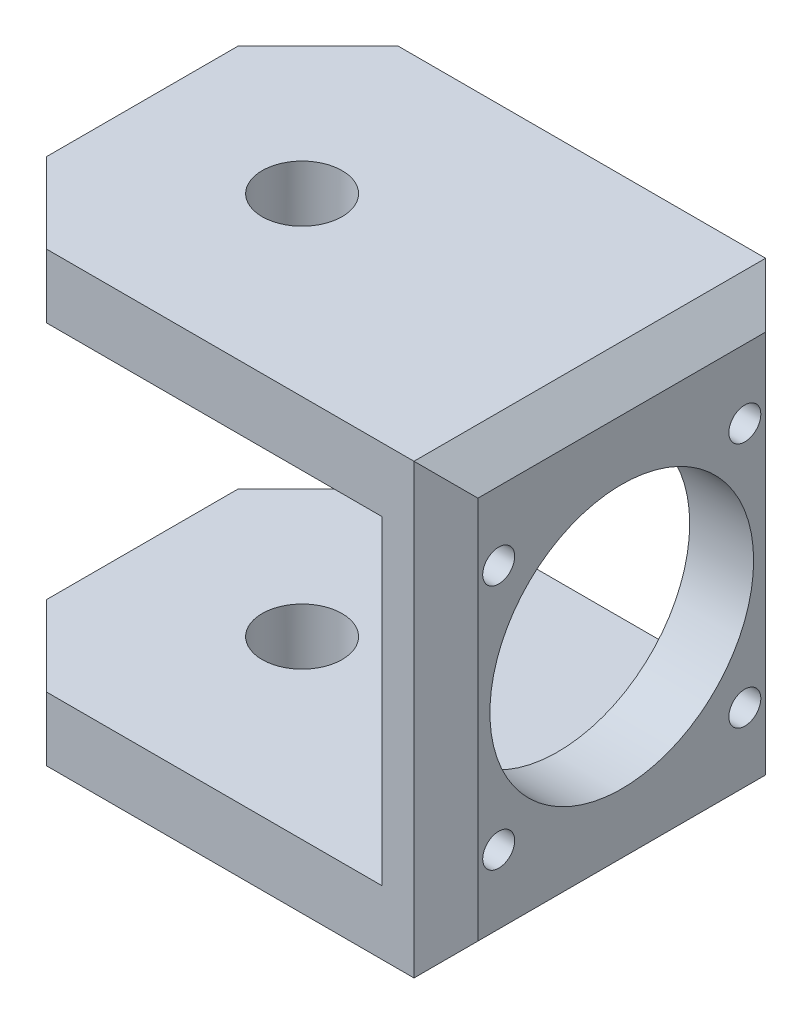
ISO-10303-21;
HEADER;
FILE_DESCRIPTION(('STEP AP214'),'2;1');
FILE_NAME('part.step','',(''),(''),'','','');
FILE_SCHEMA(('AUTOMOTIVE_DESIGN { 1 0 10303 214 1 1 1 1 }'));
ENDSEC;
DATA;
#1=APPLICATION_CONTEXT('core data for automotive mechanical design processes');
#2=APPLICATION_PROTOCOL_DEFINITION('international standard','automotive_design',2000,#1);
#3=PRODUCT_CONTEXT('',#1,'mechanical');
#4=PRODUCT('Part','Part','',(#3));
#5=PRODUCT_RELATED_PRODUCT_CATEGORY('part','',(#4));
#6=PRODUCT_DEFINITION_FORMATION('','',#4);
#7=PRODUCT_DEFINITION_CONTEXT('part definition',#1,'design');
#8=PRODUCT_DEFINITION('design','',#6,#7);
#9=PRODUCT_DEFINITION_SHAPE('','',#8);
#10=(LENGTH_UNIT() NAMED_UNIT(*) SI_UNIT(.MILLI.,.METRE.));
#11=(NAMED_UNIT(*) PLANE_ANGLE_UNIT() SI_UNIT($,.RADIAN.));
#12=(NAMED_UNIT(*) SI_UNIT($,.STERADIAN.) SOLID_ANGLE_UNIT());
#13=UNCERTAINTY_MEASURE_WITH_UNIT(LENGTH_MEASURE(1.E-05),#10,'distance_accuracy_value','');
#14=(GEOMETRIC_REPRESENTATION_CONTEXT(3) GLOBAL_UNCERTAINTY_ASSIGNED_CONTEXT((#13)) GLOBAL_UNIT_ASSIGNED_CONTEXT((#10,
#11,#12)) REPRESENTATION_CONTEXT('',''));
#15=CARTESIAN_POINT('',(0.,0.,0.));
#16=DIRECTION('',(0.,0.,1.));
#17=DIRECTION('',(1.,0.,0.));
#18=AXIS2_PLACEMENT_3D('',#15,#16,#17);
#19=CARTESIAN_POINT('',(0.,4.,0.));
#20=DIRECTION('',(0.,-1.,0.));
#21=DIRECTION('',(0.,0.,-1.));
#22=AXIS2_PLACEMENT_3D('',#19,#20,#21);
#23=PLANE('',#22);
#24=CARTESIAN_POINT('',(-5.,4.,0.));
#25=DIRECTION('',(0.,-1.,0.));
#26=DIRECTION('',(0.,0.,-1.));
#27=AXIS2_PLACEMENT_3D('',#24,#25,#26);
#28=CIRCLE('',#27,2.5);
#29=CARTESIAN_POINT('',(-5.,4.,-2.5));
#30=VERTEX_POINT('',#29);
#31=EDGE_CURVE('E262',#30,#30,#28,.T.);
#32=ORIENTED_EDGE('',*,*,#31,.T.);
#33=EDGE_LOOP('',(#32));
#34=FACE_BOUND('',#33,.T.);
#35=DIRECTION('',(0.,0.,1.));
#36=VECTOR('',#35,1.);
#37=CARTESIAN_POINT('',(-15.,4.,11.));
#38=LINE('',#37,#36);
#39=CARTESIAN_POINT('',(-15.,4.,-6.));
#40=VERTEX_POINT('',#39);
#41=CARTESIAN_POINT('',(-15.,4.,5.99999999999999));
#42=VERTEX_POINT('',#41);
#43=EDGE_CURVE('E181',#40,#42,#38,.T.);
#44=ORIENTED_EDGE('',*,*,#43,.T.);
#45=DIRECTION('',(-0.707106781186546,0.,-0.707106781186549));
#46=VECTOR('',#45,1.);
#47=CARTESIAN_POINT('',(-10.,4.,11.));
#48=LINE('',#47,#46);
#49=CARTESIAN_POINT('',(-10.,4.,11.));
#50=VERTEX_POINT('',#49);
#51=EDGE_CURVE('E208',#42,#50,#48,.F.);
#52=ORIENTED_EDGE('',*,*,#51,.T.);
#53=DIRECTION('',(1.,0.,0.));
#54=VECTOR('',#53,1.);
#55=CARTESIAN_POINT('',(-15.,4.,11.));
#56=LINE('',#55,#54);
#57=CARTESIAN_POINT('',(11.,4.,11.));
#58=VERTEX_POINT('',#57);
#59=EDGE_CURVE('E185',#50,#58,#56,.T.);
#60=ORIENTED_EDGE('',*,*,#59,.T.);
#61=DIRECTION('',(0.,0.,1.));
#62=VECTOR('',#61,1.);
#63=CARTESIAN_POINT('',(11.,4.,-11.));
#64=LINE('',#63,#62);
#65=CARTESIAN_POINT('',(11.,4.,-11.));
#66=VERTEX_POINT('',#65);
#67=EDGE_CURVE('E164',#66,#58,#64,.T.);
#68=ORIENTED_EDGE('',*,*,#67,.F.);
#69=DIRECTION('',(-1.,0.,0.));
#70=VECTOR('',#69,1.);
#71=CARTESIAN_POINT('',(-15.,4.,-11.));
#72=LINE('',#71,#70);
#73=CARTESIAN_POINT('',(-9.99999999999998,4.,-11.));
#74=VERTEX_POINT('',#73);
#75=EDGE_CURVE('E178',#66,#74,#72,.T.);
#76=ORIENTED_EDGE('',*,*,#75,.T.);
#77=DIRECTION('',(0.707106781186549,0.,-0.707106781186546));
#78=VECTOR('',#77,1.);
#79=CARTESIAN_POINT('',(-15.,4.,-6.));
#80=LINE('',#79,#78);
#81=EDGE_CURVE('E206',#74,#40,#80,.F.);
#82=ORIENTED_EDGE('',*,*,#81,.T.);
#83=EDGE_LOOP('',(#44,#52,#60,#68,#76,#82));
#84=FACE_BOUND('',#83,.T.);
#85=ADVANCED_FACE('F40',(#34,#84),#23,.F.);
#86=CARTESIAN_POINT('',(15.,4.,11.));
#87=DIRECTION('',(-1.,0.,0.));
#88=DIRECTION('',(0.,0.,1.));
#89=AXIS2_PLACEMENT_3D('',#86,#87,#88);
#90=PLANE('',#89);
#91=DIRECTION('',(0.,0.,-1.));
#92=VECTOR('',#91,1.);
#93=CARTESIAN_POINT('',(15.,2.00000000000001,-11.));
#94=LINE('',#93,#92);
#95=CARTESIAN_POINT('',(15.,2.00000000000001,8.99999999999999));
#96=VERTEX_POINT('',#95);
#97=CARTESIAN_POINT('',(15.,2.00000000000001,-8.99999999999999));
#98=VERTEX_POINT('',#97);
#99=EDGE_CURVE('E252',#96,#98,#94,.T.);
#100=ORIENTED_EDGE('',*,*,#99,.T.);
#101=DIRECTION('',(0.,1.,0.));
#102=VECTOR('',#101,1.);
#103=CARTESIAN_POINT('',(15.,4.,-8.99999999999999));
#104=LINE('',#103,#102);
#105=CARTESIAN_POINT('',(15.,26.,-8.99999999999999));
#106=VERTEX_POINT('',#105);
#107=EDGE_CURVE('E254',#98,#106,#104,.T.);
#108=ORIENTED_EDGE('',*,*,#107,.T.);
#109=DIRECTION('',(0.,0.,1.));
#110=VECTOR('',#109,1.);
#111=CARTESIAN_POINT('',(15.,26.,11.));
#112=LINE('',#111,#110);
#113=CARTESIAN_POINT('',(15.,26.,8.99999999999999));
#114=VERTEX_POINT('',#113);
#115=EDGE_CURVE('E248',#106,#114,#112,.T.);
#116=ORIENTED_EDGE('',*,*,#115,.T.);
#117=DIRECTION('',(0.,-1.,0.));
#118=VECTOR('',#117,1.);
#119=CARTESIAN_POINT('',(15.,4.,8.99999999999999));
#120=LINE('',#119,#118);
#121=EDGE_CURVE('E250',#114,#96,#120,.T.);
#122=ORIENTED_EDGE('',*,*,#121,.T.);
#123=EDGE_LOOP('',(#100,#108,#116,#122));
#124=FACE_BOUND('',#123,.T.);
#125=CARTESIAN_POINT('',(15.,6.3,-7.69999999999992));
#126=DIRECTION('',(1.,0.,0.));
#127=DIRECTION('',(0.,0.,-1.));
#128=AXIS2_PLACEMENT_3D('',#125,#126,#127);
#129=CIRCLE('',#128,1.);
#130=CARTESIAN_POINT('',(15.,6.3,-8.69999999999992));
#131=VERTEX_POINT('',#130);
#132=EDGE_CURVE('E268',#131,#131,#129,.T.);
#133=ORIENTED_EDGE('',*,*,#132,.F.);
#134=EDGE_LOOP('',(#133));
#135=FACE_BOUND('',#134,.T.);
#136=CARTESIAN_POINT('',(15.,21.7,-7.69999999999997));
#137=DIRECTION('',(1.,0.,0.));
#138=DIRECTION('',(0.,0.,-1.));
#139=AXIS2_PLACEMENT_3D('',#136,#137,#138);
#140=CIRCLE('',#139,1.);
#141=CARTESIAN_POINT('',(15.,21.7,-8.69999999999997));
#142=VERTEX_POINT('',#141);
#143=EDGE_CURVE('E274',#142,#142,#140,.T.);
#144=ORIENTED_EDGE('',*,*,#143,.F.);
#145=EDGE_LOOP('',(#144));
#146=FACE_BOUND('',#145,.T.);
#147=CARTESIAN_POINT('',(15.,21.6999999999999,7.69999999999997));
#148=DIRECTION('',(1.,0.,0.));
#149=DIRECTION('',(0.,0.,-1.));
#150=AXIS2_PLACEMENT_3D('',#147,#148,#149);
#151=CIRCLE('',#150,1.);
#152=CARTESIAN_POINT('',(15.,21.6999999999999,6.69999999999997));
#153=VERTEX_POINT('',#152);
#154=EDGE_CURVE('E279',#153,#153,#151,.T.);
#155=ORIENTED_EDGE('',*,*,#154,.F.);
#156=EDGE_LOOP('',(#155));
#157=FACE_BOUND('',#156,.T.);
#158=CARTESIAN_POINT('',(15.,6.3,7.69999999999992));
#159=DIRECTION('',(1.,0.,0.));
#160=DIRECTION('',(0.,0.,-1.));
#161=AXIS2_PLACEMENT_3D('',#158,#159,#160);
#162=CIRCLE('',#161,1.);
#163=CARTESIAN_POINT('',(15.,6.3,6.69999999999992));
#164=VERTEX_POINT('',#163);
#165=EDGE_CURVE('E237',#164,#164,#162,.T.);
#166=ORIENTED_EDGE('',*,*,#165,.F.);
#167=EDGE_LOOP('',(#166));
#168=FACE_BOUND('',#167,.T.);
#169=CARTESIAN_POINT('',(15.,14.,0.));
#170=DIRECTION('',(1.,0.,0.));
#171=DIRECTION('',(0.,0.,-1.));
#172=AXIS2_PLACEMENT_3D('',#169,#170,#171);
#173=CIRCLE('',#172,8.25);
#174=CARTESIAN_POINT('',(15.,14.,-8.25));
#175=VERTEX_POINT('',#174);
#176=EDGE_CURVE('E232',#175,#175,#173,.T.);
#177=ORIENTED_EDGE('',*,*,#176,.F.);
#178=EDGE_LOOP('',(#177));
#179=FACE_BOUND('',#178,.T.);
#180=ADVANCED_FACE('F336',(#124,#135,#146,#157,#168,#179),#90,.F.);
#181=CARTESIAN_POINT('',(-15.,4.,-11.));
#182=DIRECTION('',(0.,0.,1.));
#183=DIRECTION('',(1.,0.,0.));
#184=AXIS2_PLACEMENT_3D('',#181,#182,#183);
#185=PLANE('',#184);
#186=DIRECTION('',(-1.,0.,0.));
#187=VECTOR('',#186,1.);
#188=CARTESIAN_POINT('',(15.,28.,-11.));
#189=LINE('',#188,#187);
#190=CARTESIAN_POINT('',(13.,28.,-11.));
#191=VERTEX_POINT('',#190);
#192=CARTESIAN_POINT('',(-9.99999999999998,28.,-11.));
#193=VERTEX_POINT('',#192);
#194=EDGE_CURVE('E154',#191,#193,#189,.T.);
#195=ORIENTED_EDGE('',*,*,#194,.F.);
#196=DIRECTION('',(0.,-1.,0.));
#197=VECTOR('',#196,1.);
#198=CARTESIAN_POINT('',(13.,4.,-11.));
#199=LINE('',#198,#197);
#200=CARTESIAN_POINT('',(13.,0.,-11.));
#201=VERTEX_POINT('',#200);
#202=EDGE_CURVE('E228',#191,#201,#199,.T.);
#203=ORIENTED_EDGE('',*,*,#202,.T.);
#204=DIRECTION('',(-1.,0.,0.));
#205=VECTOR('',#204,1.);
#206=CARTESIAN_POINT('',(-15.,0.,-11.));
#207=LINE('',#206,#205);
#208=CARTESIAN_POINT('',(-9.99999999999998,0.,-11.));
#209=VERTEX_POINT('',#208);
#210=EDGE_CURVE('E177',#201,#209,#207,.T.);
#211=ORIENTED_EDGE('',*,*,#210,.T.);
#212=DIRECTION('',(0.,1.,0.));
#213=VECTOR('',#212,1.);
#214=CARTESIAN_POINT('',(-9.99999999999998,4.,-11.));
#215=LINE('',#214,#213);
#216=EDGE_CURVE('E213',#209,#74,#215,.T.);
#217=ORIENTED_EDGE('',*,*,#216,.T.);
#218=ORIENTED_EDGE('',*,*,#75,.F.);
#219=DIRECTION('',(0.,-1.,0.));
#220=VECTOR('',#219,1.);
#221=CARTESIAN_POINT('',(11.,24.,-11.));
#222=LINE('',#221,#220);
#223=CARTESIAN_POINT('',(11.,24.,-11.));
#224=VERTEX_POINT('',#223);
#225=EDGE_CURVE('E165',#224,#66,#222,.T.);
#226=ORIENTED_EDGE('',*,*,#225,.F.);
#227=DIRECTION('',(-1.,0.,0.));
#228=VECTOR('',#227,1.);
#229=CARTESIAN_POINT('',(15.,24.,-11.));
#230=LINE('',#229,#228);
#231=CARTESIAN_POINT('',(-9.99999999999998,24.,-11.));
#232=VERTEX_POINT('',#231);
#233=EDGE_CURVE('E170',#224,#232,#230,.T.);
#234=ORIENTED_EDGE('',*,*,#233,.T.);
#235=DIRECTION('',(0.,1.,0.));
#236=VECTOR('',#235,1.);
#237=CARTESIAN_POINT('',(-9.99999999999998,4.,-11.));
#238=LINE('',#237,#236);
#239=EDGE_CURVE('E210',#232,#193,#238,.T.);
#240=ORIENTED_EDGE('',*,*,#239,.T.);
#241=EDGE_LOOP('',(#195,#203,#211,#217,#218,#226,#234,#240));
#242=FACE_BOUND('',#241,.T.);
#243=ADVANCED_FACE('F309',(#242),#185,.F.);
#244=CARTESIAN_POINT('',(-15.,4.,11.));
#245=DIRECTION('',(1.,0.,0.));
#246=DIRECTION('',(0.,0.,-1.));
#247=AXIS2_PLACEMENT_3D('',#244,#245,#246);
#248=PLANE('',#247);
#249=DIRECTION('',(0.,0.,1.));
#250=VECTOR('',#249,1.);
#251=CARTESIAN_POINT('',(-15.,0.,11.));
#252=LINE('',#251,#250);
#253=CARTESIAN_POINT('',(-15.,0.,-6.));
#254=VERTEX_POINT('',#253);
#255=CARTESIAN_POINT('',(-15.,0.,5.99999999999999));
#256=VERTEX_POINT('',#255);
#257=EDGE_CURVE('E188',#254,#256,#252,.T.);
#258=ORIENTED_EDGE('',*,*,#257,.T.);
#259=DIRECTION('',(0.,1.,0.));
#260=VECTOR('',#259,1.);
#261=CARTESIAN_POINT('',(-15.,4.,5.99999999999999));
#262=LINE('',#261,#260);
#263=EDGE_CURVE('E204',#256,#42,#262,.T.);
#264=ORIENTED_EDGE('',*,*,#263,.T.);
#265=ORIENTED_EDGE('',*,*,#43,.F.);
#266=DIRECTION('',(0.,-1.,0.));
#267=VECTOR('',#266,1.);
#268=CARTESIAN_POINT('',(-15.,4.,-6.));
#269=LINE('',#268,#267);
#270=EDGE_CURVE('E201',#40,#254,#269,.T.);
#271=ORIENTED_EDGE('',*,*,#270,.T.);
#272=EDGE_LOOP('',(#258,#264,#265,#271));
#273=FACE_BOUND('',#272,.T.);
#274=ADVANCED_FACE('F320',(#273),#248,.F.);
#275=CARTESIAN_POINT('',(-15.,4.,11.));
#276=DIRECTION('',(0.,0.,-1.));
#277=DIRECTION('',(-1.,0.,0.));
#278=AXIS2_PLACEMENT_3D('',#275,#276,#277);
#279=PLANE('',#278);
#280=DIRECTION('',(1.,0.,0.));
#281=VECTOR('',#280,1.);
#282=CARTESIAN_POINT('',(-15.,0.,11.));
#283=LINE('',#282,#281);
#284=CARTESIAN_POINT('',(-10.,0.,11.));
#285=VERTEX_POINT('',#284);
#286=CARTESIAN_POINT('',(13.,0.,11.));
#287=VERTEX_POINT('',#286);
#288=EDGE_CURVE('E182',#285,#287,#283,.T.);
#289=ORIENTED_EDGE('',*,*,#288,.T.);
#290=DIRECTION('',(0.,1.,0.));
#291=VECTOR('',#290,1.);
#292=CARTESIAN_POINT('',(13.,4.,11.));
#293=LINE('',#292,#291);
#294=CARTESIAN_POINT('',(13.,28.,11.));
#295=VERTEX_POINT('',#294);
#296=EDGE_CURVE('E50',#287,#295,#293,.T.);
#297=ORIENTED_EDGE('',*,*,#296,.T.);
#298=DIRECTION('',(1.,0.,0.));
#299=VECTOR('',#298,1.);
#300=CARTESIAN_POINT('',(15.,28.,11.));
#301=LINE('',#300,#299);
#302=CARTESIAN_POINT('',(-10.,28.,11.));
#303=VERTEX_POINT('',#302);
#304=EDGE_CURVE('E172',#303,#295,#301,.T.);
#305=ORIENTED_EDGE('',*,*,#304,.F.);
#306=DIRECTION('',(0.,-1.,0.));
#307=VECTOR('',#306,1.);
#308=CARTESIAN_POINT('',(-10.,4.,11.));
#309=LINE('',#308,#307);
#310=CARTESIAN_POINT('',(-10.,24.,11.));
#311=VERTEX_POINT('',#310);
#312=EDGE_CURVE('E151',#303,#311,#309,.T.);
#313=ORIENTED_EDGE('',*,*,#312,.T.);
#314=DIRECTION('',(1.,0.,0.));
#315=VECTOR('',#314,1.);
#316=CARTESIAN_POINT('',(15.,24.,11.));
#317=LINE('',#316,#315);
#318=CARTESIAN_POINT('',(11.,24.,11.));
#319=VERTEX_POINT('',#318);
#320=EDGE_CURVE('E145',#311,#319,#317,.T.);
#321=ORIENTED_EDGE('',*,*,#320,.T.);
#322=DIRECTION('',(0.,-1.,0.));
#323=VECTOR('',#322,1.);
#324=CARTESIAN_POINT('',(11.,24.,11.));
#325=LINE('',#324,#323);
#326=EDGE_CURVE('E149',#319,#58,#325,.T.);
#327=ORIENTED_EDGE('',*,*,#326,.T.);
#328=ORIENTED_EDGE('',*,*,#59,.F.);
#329=DIRECTION('',(0.,-1.,0.));
#330=VECTOR('',#329,1.);
#331=CARTESIAN_POINT('',(-10.,4.,11.));
#332=LINE('',#331,#330);
#333=EDGE_CURVE('E193',#50,#285,#332,.T.);
#334=ORIENTED_EDGE('',*,*,#333,.T.);
#335=EDGE_LOOP('',(#289,#297,#305,#313,#321,#327,#328,#334));
#336=FACE_BOUND('',#335,.T.);
#337=ADVANCED_FACE('F147',(#336),#279,.F.);
#338=CARTESIAN_POINT('',(0.,0.,0.));
#339=DIRECTION('',(0.,-1.,0.));
#340=DIRECTION('',(0.,0.,-1.));
#341=AXIS2_PLACEMENT_3D('',#338,#339,#340);
#342=PLANE('',#341);
#343=CARTESIAN_POINT('',(-5.,0.,0.));
#344=DIRECTION('',(0.,1.,0.));
#345=DIRECTION('',(0.,0.,1.));
#346=AXIS2_PLACEMENT_3D('',#343,#344,#345);
#347=CIRCLE('',#346,2.5);
#348=CARTESIAN_POINT('',(-5.,0.,2.5));
#349=VERTEX_POINT('',#348);
#350=EDGE_CURVE('E667',#349,#349,#347,.T.);
#351=ORIENTED_EDGE('',*,*,#350,.T.);
#352=EDGE_LOOP('',(#351));
#353=FACE_BOUND('',#352,.T.);
#354=ORIENTED_EDGE('',*,*,#210,.F.);
#355=DIRECTION('',(0.,0.,1.));
#356=VECTOR('',#355,1.);
#357=CARTESIAN_POINT('',(13.,0.,11.));
#358=LINE('',#357,#356);
#359=EDGE_CURVE('E65',#201,#287,#358,.T.);
#360=ORIENTED_EDGE('',*,*,#359,.T.);
#361=ORIENTED_EDGE('',*,*,#288,.F.);
#362=DIRECTION('',(0.707106781186546,0.,0.707106781186549));
#363=VECTOR('',#362,1.);
#364=CARTESIAN_POINT('',(-10.5,0.,10.5));
#365=LINE('',#364,#363);
#366=EDGE_CURVE('E199',#285,#256,#365,.F.);
#367=ORIENTED_EDGE('',*,*,#366,.T.);
#368=ORIENTED_EDGE('',*,*,#257,.F.);
#369=DIRECTION('',(-0.707106781186549,0.,0.707106781186546));
#370=VECTOR('',#369,1.);
#371=CARTESIAN_POINT('',(-10.5,0.,-10.5));
#372=LINE('',#371,#370);
#373=EDGE_CURVE('E196',#254,#209,#372,.F.);
#374=ORIENTED_EDGE('',*,*,#373,.T.);
#375=EDGE_LOOP('',(#354,#360,#361,#367,#368,#374));
#376=FACE_BOUND('',#375,.T.);
#377=ADVANCED_FACE('F322',(#353,#376),#342,.T.);
#378=CARTESIAN_POINT('',(11.,24.,-11.));
#379=DIRECTION('',(1.,0.,0.));
#380=DIRECTION('',(0.,0.,-1.));
#381=AXIS2_PLACEMENT_3D('',#378,#379,#380);
#382=PLANE('',#381);
#383=CARTESIAN_POINT('',(11.,6.3,-7.69999999999992));
#384=DIRECTION('',(1.,0.,0.));
#385=DIRECTION('',(0.,0.,-1.));
#386=AXIS2_PLACEMENT_3D('',#383,#384,#385);
#387=CIRCLE('',#386,1.);
#388=CARTESIAN_POINT('',(11.,6.3,-8.69999999999992));
#389=VERTEX_POINT('',#388);
#390=EDGE_CURVE('E243',#389,#389,#387,.T.);
#391=ORIENTED_EDGE('',*,*,#390,.T.);
#392=EDGE_LOOP('',(#391));
#393=FACE_BOUND('',#392,.T.);
#394=CARTESIAN_POINT('',(11.,21.7,-7.69999999999997));
#395=DIRECTION('',(1.,0.,0.));
#396=DIRECTION('',(0.,0.,-1.));
#397=AXIS2_PLACEMENT_3D('',#394,#395,#396);
#398=CIRCLE('',#397,1.);
#399=CARTESIAN_POINT('',(11.,21.7,-8.69999999999997));
#400=VERTEX_POINT('',#399);
#401=EDGE_CURVE('E240',#400,#400,#398,.T.);
#402=ORIENTED_EDGE('',*,*,#401,.T.);
#403=EDGE_LOOP('',(#402));
#404=FACE_BOUND('',#403,.T.);
#405=CARTESIAN_POINT('',(11.,21.6999999999999,7.69999999999997));
#406=DIRECTION('',(1.,0.,0.));
#407=DIRECTION('',(0.,0.,-1.));
#408=AXIS2_PLACEMENT_3D('',#405,#406,#407);
#409=CIRCLE('',#408,1.);
#410=CARTESIAN_POINT('',(11.,21.6999999999999,6.69999999999997));
#411=VERTEX_POINT('',#410);
#412=EDGE_CURVE('E236',#411,#411,#409,.T.);
#413=ORIENTED_EDGE('',*,*,#412,.T.);
#414=EDGE_LOOP('',(#413));
#415=FACE_BOUND('',#414,.T.);
#416=CARTESIAN_POINT('',(11.,6.3,7.69999999999992));
#417=DIRECTION('',(1.,0.,0.));
#418=DIRECTION('',(0.,0.,-1.));
#419=AXIS2_PLACEMENT_3D('',#416,#417,#418);
#420=CIRCLE('',#419,1.);
#421=CARTESIAN_POINT('',(11.,6.3,6.69999999999992));
#422=VERTEX_POINT('',#421);
#423=EDGE_CURVE('E233',#422,#422,#420,.T.);
#424=ORIENTED_EDGE('',*,*,#423,.T.);
#425=EDGE_LOOP('',(#424));
#426=FACE_BOUND('',#425,.T.);
#427=CARTESIAN_POINT('',(11.,14.,0.));
#428=DIRECTION('',(1.,0.,0.));
#429=DIRECTION('',(0.,0.,-1.));
#430=AXIS2_PLACEMENT_3D('',#427,#428,#429);
#431=CIRCLE('',#430,8.25);
#432=CARTESIAN_POINT('',(11.,14.,-8.25));
#433=VERTEX_POINT('',#432);
#434=EDGE_CURVE('E229',#433,#433,#431,.T.);
#435=ORIENTED_EDGE('',*,*,#434,.T.);
#436=EDGE_LOOP('',(#435));
#437=FACE_BOUND('',#436,.T.);
#438=ORIENTED_EDGE('',*,*,#67,.T.);
#439=ORIENTED_EDGE('',*,*,#326,.F.);
#440=DIRECTION('',(0.,0.,1.));
#441=VECTOR('',#440,1.);
#442=CARTESIAN_POINT('',(11.,24.,-11.));
#443=LINE('',#442,#441);
#444=EDGE_CURVE('E162',#224,#319,#443,.T.);
#445=ORIENTED_EDGE('',*,*,#444,.F.);
#446=ORIENTED_EDGE('',*,*,#225,.T.);
#447=EDGE_LOOP('',(#438,#439,#445,#446));
#448=FACE_BOUND('',#447,.T.);
#449=ADVANCED_FACE('F160',(#393,#404,#415,#426,#437,#448),#382,.F.);
#450=CARTESIAN_POINT('',(-15.,28.,-11.));
#451=DIRECTION('',(1.,0.,0.));
#452=DIRECTION('',(0.,0.,-1.));
#453=AXIS2_PLACEMENT_3D('',#450,#451,#452);
#454=PLANE('',#453);
#455=DIRECTION('',(0.,0.,1.));
#456=VECTOR('',#455,1.);
#457=CARTESIAN_POINT('',(-15.,28.,-11.));
#458=LINE('',#457,#456);
#459=CARTESIAN_POINT('',(-15.,28.,-6.));
#460=VERTEX_POINT('',#459);
#461=CARTESIAN_POINT('',(-15.,28.,5.99999999999999));
#462=VERTEX_POINT('',#461);
#463=EDGE_CURVE('E288',#460,#462,#458,.T.);
#464=ORIENTED_EDGE('',*,*,#463,.F.);
#465=DIRECTION('',(0.,-1.,0.));
#466=VECTOR('',#465,1.);
#467=CARTESIAN_POINT('',(-15.,28.,-6.));
#468=LINE('',#467,#466);
#469=CARTESIAN_POINT('',(-15.,24.,-6.));
#470=VERTEX_POINT('',#469);
#471=EDGE_CURVE('E217',#460,#470,#468,.T.);
#472=ORIENTED_EDGE('',*,*,#471,.T.);
#473=DIRECTION('',(0.,0.,1.));
#474=VECTOR('',#473,1.);
#475=CARTESIAN_POINT('',(-15.,24.,-11.));
#476=LINE('',#475,#474);
#477=CARTESIAN_POINT('',(-15.,24.,5.99999999999999));
#478=VERTEX_POINT('',#477);
#479=EDGE_CURVE('E155',#470,#478,#476,.T.);
#480=ORIENTED_EDGE('',*,*,#479,.T.);
#481=DIRECTION('',(0.,1.,0.));
#482=VECTOR('',#481,1.);
#483=CARTESIAN_POINT('',(-15.,28.,5.99999999999999));
#484=LINE('',#483,#482);
#485=EDGE_CURVE('E215',#478,#462,#484,.T.);
#486=ORIENTED_EDGE('',*,*,#485,.T.);
#487=EDGE_LOOP('',(#464,#472,#480,#486));
#488=FACE_BOUND('',#487,.T.);
#489=ADVANCED_FACE('F296',(#488),#454,.F.);
#490=CARTESIAN_POINT('',(0.,28.,0.));
#491=DIRECTION('',(0.,-1.,0.));
#492=DIRECTION('',(0.,0.,-1.));
#493=AXIS2_PLACEMENT_3D('',#490,#491,#492);
#494=PLANE('',#493);
#495=CARTESIAN_POINT('',(-5.,28.,0.));
#496=DIRECTION('',(0.,1.,0.));
#497=DIRECTION('',(0.,0.,1.));
#498=AXIS2_PLACEMENT_3D('',#495,#496,#497);
#499=CIRCLE('',#498,2.5);
#500=CARTESIAN_POINT('',(-5.,28.,2.5));
#501=VERTEX_POINT('',#500);
#502=EDGE_CURVE('E670',#501,#501,#499,.T.);
#503=ORIENTED_EDGE('',*,*,#502,.F.);
#504=EDGE_LOOP('',(#503));
#505=FACE_BOUND('',#504,.T.);
#506=ORIENTED_EDGE('',*,*,#304,.T.);
#507=DIRECTION('',(0.,0.,-1.));
#508=VECTOR('',#507,1.);
#509=CARTESIAN_POINT('',(13.,28.,0.));
#510=LINE('',#509,#508);
#511=EDGE_CURVE('E11',#295,#191,#510,.T.);
#512=ORIENTED_EDGE('',*,*,#511,.T.);
#513=ORIENTED_EDGE('',*,*,#194,.T.);
#514=DIRECTION('',(0.707106781186549,0.,-0.707106781186546));
#515=VECTOR('',#514,1.);
#516=CARTESIAN_POINT('',(-15.,28.,-6.));
#517=LINE('',#516,#515);
#518=EDGE_CURVE('E226',#193,#460,#517,.F.);
#519=ORIENTED_EDGE('',*,*,#518,.T.);
#520=ORIENTED_EDGE('',*,*,#463,.T.);
#521=DIRECTION('',(-0.707106781186546,0.,-0.707106781186549));
#522=VECTOR('',#521,1.);
#523=CARTESIAN_POINT('',(-10.,28.,11.));
#524=LINE('',#523,#522);
#525=EDGE_CURVE('E224',#462,#303,#524,.F.);
#526=ORIENTED_EDGE('',*,*,#525,.T.);
#527=EDGE_LOOP('',(#506,#512,#513,#519,#520,#526));
#528=FACE_BOUND('',#527,.T.);
#529=ADVANCED_FACE('F302',(#505,#528),#494,.F.);
#530=CARTESIAN_POINT('',(0.,24.,0.));
#531=DIRECTION('',(0.,-1.,0.));
#532=DIRECTION('',(0.,0.,-1.));
#533=AXIS2_PLACEMENT_3D('',#530,#531,#532);
#534=PLANE('',#533);
#535=CARTESIAN_POINT('',(-5.,24.,0.));
#536=DIRECTION('',(0.,-1.,0.));
#537=DIRECTION('',(0.,0.,-1.));
#538=AXIS2_PLACEMENT_3D('',#535,#536,#537);
#539=CIRCLE('',#538,2.5);
#540=CARTESIAN_POINT('',(-5.,24.,-2.5));
#541=VERTEX_POINT('',#540);
#542=EDGE_CURVE('E45',#541,#541,#539,.T.);
#543=ORIENTED_EDGE('',*,*,#542,.F.);
#544=EDGE_LOOP('',(#543));
#545=FACE_BOUND('',#544,.T.);
#546=ORIENTED_EDGE('',*,*,#479,.F.);
#547=DIRECTION('',(-0.707106781186549,0.,0.707106781186546));
#548=VECTOR('',#547,1.);
#549=CARTESIAN_POINT('',(-10.5,24.,-10.5));
#550=LINE('',#549,#548);
#551=EDGE_CURVE('E222',#470,#232,#550,.F.);
#552=ORIENTED_EDGE('',*,*,#551,.T.);
#553=ORIENTED_EDGE('',*,*,#233,.F.);
#554=ORIENTED_EDGE('',*,*,#444,.T.);
#555=ORIENTED_EDGE('',*,*,#320,.F.);
#556=DIRECTION('',(0.707106781186546,0.,0.707106781186549));
#557=VECTOR('',#556,1.);
#558=CARTESIAN_POINT('',(-10.5,24.,10.5));
#559=LINE('',#558,#557);
#560=EDGE_CURVE('E220',#311,#478,#559,.F.);
#561=ORIENTED_EDGE('',*,*,#560,.T.);
#562=EDGE_LOOP('',(#546,#552,#553,#554,#555,#561));
#563=FACE_BOUND('',#562,.T.);
#564=ADVANCED_FACE('F168',(#545,#563),#534,.T.);
#565=CARTESIAN_POINT('',(-10.,4.,11.));
#566=DIRECTION('',(0.707106781186549,0.,-0.707106781186546));
#567=DIRECTION('',(0.,-1.,0.));
#568=AXIS2_PLACEMENT_3D('',#565,#566,#567);
#569=PLANE('',#568);
#570=ORIENTED_EDGE('',*,*,#51,.F.);
#571=ORIENTED_EDGE('',*,*,#263,.F.);
#572=ORIENTED_EDGE('',*,*,#366,.F.);
#573=ORIENTED_EDGE('',*,*,#333,.F.);
#574=EDGE_LOOP('',(#570,#571,#572,#573));
#575=FACE_BOUND('',#574,.T.);
#576=ADVANCED_FACE('F326',(#575),#569,.F.);
#577=CARTESIAN_POINT('',(-15.,4.,-6.));
#578=DIRECTION('',(0.707106781186546,0.,0.707106781186549));
#579=DIRECTION('',(0.,-1.,0.));
#580=AXIS2_PLACEMENT_3D('',#577,#578,#579);
#581=PLANE('',#580);
#582=ORIENTED_EDGE('',*,*,#81,.F.);
#583=ORIENTED_EDGE('',*,*,#216,.F.);
#584=ORIENTED_EDGE('',*,*,#373,.F.);
#585=ORIENTED_EDGE('',*,*,#270,.F.);
#586=EDGE_LOOP('',(#582,#583,#584,#585));
#587=FACE_BOUND('',#586,.T.);
#588=ADVANCED_FACE('F317',(#587),#581,.F.);
#589=CARTESIAN_POINT('',(-15.,28.,-6.));
#590=DIRECTION('',(0.707106781186546,0.,0.707106781186549));
#591=DIRECTION('',(0.,-1.,0.));
#592=AXIS2_PLACEMENT_3D('',#589,#590,#591);
#593=PLANE('',#592);
#594=ORIENTED_EDGE('',*,*,#518,.F.);
#595=ORIENTED_EDGE('',*,*,#239,.F.);
#596=ORIENTED_EDGE('',*,*,#551,.F.);
#597=ORIENTED_EDGE('',*,*,#471,.F.);
#598=EDGE_LOOP('',(#594,#595,#596,#597));
#599=FACE_BOUND('',#598,.T.);
#600=ADVANCED_FACE('F305',(#599),#593,.F.);
#601=CARTESIAN_POINT('',(-10.,4.,11.));
#602=DIRECTION('',(0.707106781186549,0.,-0.707106781186546));
#603=DIRECTION('',(0.,-1.,0.));
#604=AXIS2_PLACEMENT_3D('',#601,#602,#603);
#605=PLANE('',#604);
#606=ORIENTED_EDGE('',*,*,#525,.F.);
#607=ORIENTED_EDGE('',*,*,#485,.F.);
#608=ORIENTED_EDGE('',*,*,#560,.F.);
#609=ORIENTED_EDGE('',*,*,#312,.F.);
#610=EDGE_LOOP('',(#606,#607,#608,#609));
#611=FACE_BOUND('',#610,.T.);
#612=ADVANCED_FACE('F300',(#611),#605,.F.);
#613=CARTESIAN_POINT('',(-15.,14.,0.));
#614=DIRECTION('',(1.,0.,0.));
#615=DIRECTION('',(0.,0.,-1.));
#616=AXIS2_PLACEMENT_3D('',#613,#614,#615);
#617=CYLINDRICAL_SURFACE('',#616,8.25);
#618=ORIENTED_EDGE('',*,*,#176,.T.);
#619=EDGE_LOOP('',(#618));
#620=FACE_BOUND('',#619,.T.);
#621=ORIENTED_EDGE('',*,*,#434,.F.);
#622=EDGE_LOOP('',(#621));
#623=FACE_BOUND('',#622,.T.);
#624=ADVANCED_FACE('F391',(#620,#623),#617,.F.);
#625=CARTESIAN_POINT('',(-15.,6.3,7.69999999999992));
#626=DIRECTION('',(1.,0.,0.));
#627=DIRECTION('',(0.,0.,-1.));
#628=AXIS2_PLACEMENT_3D('',#625,#626,#627);
#629=CYLINDRICAL_SURFACE('',#628,1.);
#630=ORIENTED_EDGE('',*,*,#165,.T.);
#631=EDGE_LOOP('',(#630));
#632=FACE_BOUND('',#631,.T.);
#633=ORIENTED_EDGE('',*,*,#423,.F.);
#634=EDGE_LOOP('',(#633));
#635=FACE_BOUND('',#634,.T.);
#636=ADVANCED_FACE('F421',(#632,#635),#629,.F.);
#637=CARTESIAN_POINT('',(-15.,21.6999999999999,7.69999999999997));
#638=DIRECTION('',(1.,0.,0.));
#639=DIRECTION('',(0.,0.,-1.));
#640=AXIS2_PLACEMENT_3D('',#637,#638,#639);
#641=CYLINDRICAL_SURFACE('',#640,1.);
#642=ORIENTED_EDGE('',*,*,#154,.T.);
#643=EDGE_LOOP('',(#642));
#644=FACE_BOUND('',#643,.T.);
#645=ORIENTED_EDGE('',*,*,#412,.F.);
#646=EDGE_LOOP('',(#645));
#647=FACE_BOUND('',#646,.T.);
#648=ADVANCED_FACE('F417',(#644,#647),#641,.F.);
#649=CARTESIAN_POINT('',(-15.,21.7,-7.69999999999997));
#650=DIRECTION('',(1.,0.,0.));
#651=DIRECTION('',(0.,0.,-1.));
#652=AXIS2_PLACEMENT_3D('',#649,#650,#651);
#653=CYLINDRICAL_SURFACE('',#652,1.);
#654=ORIENTED_EDGE('',*,*,#143,.T.);
#655=EDGE_LOOP('',(#654));
#656=FACE_BOUND('',#655,.T.);
#657=ORIENTED_EDGE('',*,*,#401,.F.);
#658=EDGE_LOOP('',(#657));
#659=FACE_BOUND('',#658,.T.);
#660=ADVANCED_FACE('F420',(#656,#659),#653,.F.);
#661=CARTESIAN_POINT('',(-15.,6.3,-7.69999999999992));
#662=DIRECTION('',(1.,0.,0.));
#663=DIRECTION('',(0.,0.,-1.));
#664=AXIS2_PLACEMENT_3D('',#661,#662,#663);
#665=CYLINDRICAL_SURFACE('',#664,1.);
#666=ORIENTED_EDGE('',*,*,#132,.T.);
#667=EDGE_LOOP('',(#666));
#668=FACE_BOUND('',#667,.T.);
#669=ORIENTED_EDGE('',*,*,#390,.F.);
#670=EDGE_LOOP('',(#669));
#671=FACE_BOUND('',#670,.T.);
#672=ADVANCED_FACE('F349',(#668,#671),#665,.F.);
#673=CARTESIAN_POINT('',(15.,4.,8.99999999999999));
#674=DIRECTION('',(-0.70710678118655,0.,-0.707106781186545));
#675=DIRECTION('',(0.,-1.,0.));
#676=AXIS2_PLACEMENT_3D('',#673,#674,#675);
#677=PLANE('',#676);
#678=DIRECTION('',(-0.577350269189623,-0.577350269189627,0.577350269189627));
#679=VECTOR('',#678,1.);
#680=CARTESIAN_POINT('',(15.6666666666667,2.66666666666668,8.33333333333332));
#681=LINE('',#680,#679);
#682=EDGE_CURVE('E264',#96,#287,#681,.T.);
#683=ORIENTED_EDGE('',*,*,#682,.F.);
#684=ORIENTED_EDGE('',*,*,#121,.F.);
#685=DIRECTION('',(0.577350269189623,-0.577350269189627,-0.577350269189627));
#686=VECTOR('',#685,1.);
#687=CARTESIAN_POINT('',(16.6666666666667,24.3333333333333,7.33333333333332));
#688=LINE('',#687,#686);
#689=EDGE_CURVE('E266',#295,#114,#688,.T.);
#690=ORIENTED_EDGE('',*,*,#689,.F.);
#691=ORIENTED_EDGE('',*,*,#296,.F.);
#692=EDGE_LOOP('',(#683,#684,#690,#691));
#693=FACE_BOUND('',#692,.T.);
#694=ADVANCED_FACE('F43',(#693),#677,.F.);
#695=CARTESIAN_POINT('',(13.,28.,0.));
#696=DIRECTION('',(-0.70710678118655,-0.707106781186545,0.));
#697=DIRECTION('',(0.,0.,-1.));
#698=AXIS2_PLACEMENT_3D('',#695,#696,#697);
#699=PLANE('',#698);
#700=ORIENTED_EDGE('',*,*,#689,.T.);
#701=ORIENTED_EDGE('',*,*,#115,.F.);
#702=DIRECTION('',(-0.577350269189623,0.577350269189627,-0.577350269189627));
#703=VECTOR('',#702,1.);
#704=CARTESIAN_POINT('',(16.6666666666667,24.3333333333333,-7.33333333333332));
#705=LINE('',#704,#703);
#706=EDGE_CURVE('E261',#191,#106,#705,.F.);
#707=ORIENTED_EDGE('',*,*,#706,.F.);
#708=ORIENTED_EDGE('',*,*,#511,.F.);
#709=EDGE_LOOP('',(#700,#701,#707,#708));
#710=FACE_BOUND('',#709,.T.);
#711=ADVANCED_FACE('F342',(#710),#699,.F.);
#712=CARTESIAN_POINT('',(15.,2.00000000000001,11.));
#713=DIRECTION('',(0.70710678118655,-0.707106781186545,0.));
#714=DIRECTION('',(0.,0.,1.));
#715=AXIS2_PLACEMENT_3D('',#712,#713,#714);
#716=PLANE('',#715);
#717=ORIENTED_EDGE('',*,*,#682,.T.);
#718=ORIENTED_EDGE('',*,*,#359,.F.);
#719=DIRECTION('',(-0.577350269189623,-0.577350269189627,-0.577350269189627));
#720=VECTOR('',#719,1.);
#721=CARTESIAN_POINT('',(21.6666666666666,8.6666666666667,-2.3333333333333));
#722=LINE('',#721,#720);
#723=EDGE_CURVE('E259',#98,#201,#722,.T.);
#724=ORIENTED_EDGE('',*,*,#723,.F.);
#725=ORIENTED_EDGE('',*,*,#99,.F.);
#726=EDGE_LOOP('',(#717,#718,#724,#725));
#727=FACE_BOUND('',#726,.T.);
#728=ADVANCED_FACE('F332',(#727),#716,.T.);
#729=CARTESIAN_POINT('',(13.,4.,-11.));
#730=DIRECTION('',(-0.70710678118655,0.,0.707106781186545));
#731=DIRECTION('',(0.,-1.,0.));
#732=AXIS2_PLACEMENT_3D('',#729,#730,#731);
#733=PLANE('',#732);
#734=ORIENTED_EDGE('',*,*,#706,.T.);
#735=ORIENTED_EDGE('',*,*,#107,.F.);
#736=ORIENTED_EDGE('',*,*,#723,.T.);
#737=ORIENTED_EDGE('',*,*,#202,.F.);
#738=EDGE_LOOP('',(#734,#735,#736,#737));
#739=FACE_BOUND('',#738,.T.);
#740=ADVANCED_FACE('F339',(#739),#733,.F.);
#741=CARTESIAN_POINT('',(-5.,0.,0.));
#742=DIRECTION('',(0.,1.,0.));
#743=DIRECTION('',(0.,0.,1.));
#744=AXIS2_PLACEMENT_3D('',#741,#742,#743);
#745=CYLINDRICAL_SURFACE('',#744,2.5);
#746=ORIENTED_EDGE('',*,*,#542,.T.);
#747=EDGE_LOOP('',(#746));
#748=FACE_BOUND('',#747,.T.);
#749=ORIENTED_EDGE('',*,*,#502,.T.);
#750=EDGE_LOOP('',(#749));
#751=FACE_BOUND('',#750,.T.);
#752=ADVANCED_FACE('F397',(#748,#751),#745,.F.);
#753=ORIENTED_EDGE('',*,*,#350,.F.);
#754=EDGE_LOOP('',(#753));
#755=FACE_BOUND('',#754,.T.);
#756=ORIENTED_EDGE('',*,*,#31,.F.);
#757=EDGE_LOOP('',(#756));
#758=FACE_BOUND('',#757,.T.);
#759=ADVANCED_FACE('F407',(#755,#758),#745,.F.);
#760=CLOSED_SHELL('',(#85,#180,#243,#274,#337,#377,#449,#489,#529,#564,#576,#588,#600,#612,#624,
#636,#648,#660,#672,#694,#711,#728,#740,#752,#759));
#761=MANIFOLD_SOLID_BREP('B2',#760);
#762=ADVANCED_BREP_SHAPE_REPRESENTATION('',(#18,#761),#14);
#763=SHAPE_DEFINITION_REPRESENTATION(#9,#762);
ENDSEC;
END-ISO-10303-21;
